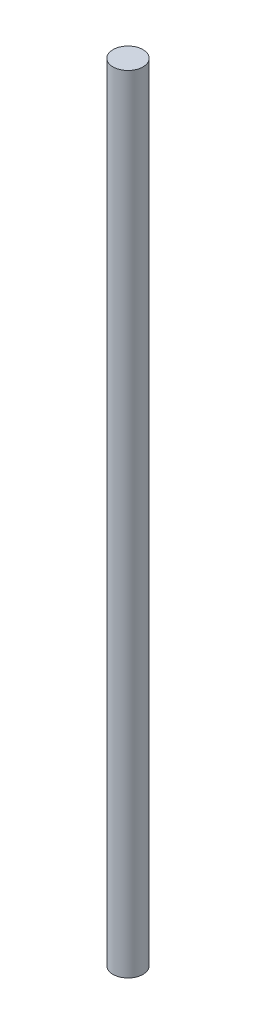
ISO-10303-21;
HEADER;
FILE_DESCRIPTION(('STEP AP214'),'2;1');
FILE_NAME('part.step','',(''),(''),'','','');
FILE_SCHEMA(('AUTOMOTIVE_DESIGN { 1 0 10303 214 1 1 1 1 }'));
ENDSEC;
DATA;
#1=APPLICATION_CONTEXT('core data for automotive mechanical design processes');
#2=APPLICATION_PROTOCOL_DEFINITION('international standard','automotive_design',2000,#1);
#3=PRODUCT_CONTEXT('',#1,'mechanical');
#4=PRODUCT('Part','Part','',(#3));
#5=PRODUCT_RELATED_PRODUCT_CATEGORY('part','',(#4));
#6=PRODUCT_DEFINITION_FORMATION('','',#4);
#7=PRODUCT_DEFINITION_CONTEXT('part definition',#1,'design');
#8=PRODUCT_DEFINITION('design','',#6,#7);
#9=PRODUCT_DEFINITION_SHAPE('','',#8);
#10=(LENGTH_UNIT() NAMED_UNIT(*) SI_UNIT(.MILLI.,.METRE.));
#11=(NAMED_UNIT(*) PLANE_ANGLE_UNIT() SI_UNIT($,.RADIAN.));
#12=(NAMED_UNIT(*) SI_UNIT($,.STERADIAN.) SOLID_ANGLE_UNIT());
#13=UNCERTAINTY_MEASURE_WITH_UNIT(LENGTH_MEASURE(1.E-05),#10,'distance_accuracy_value','');
#14=(GEOMETRIC_REPRESENTATION_CONTEXT(3) GLOBAL_UNCERTAINTY_ASSIGNED_CONTEXT((#13)) GLOBAL_UNIT_ASSIGNED_CONTEXT((#10,
#11,#12)) REPRESENTATION_CONTEXT('',''));
#15=CARTESIAN_POINT('',(0.,0.,0.));
#16=DIRECTION('',(0.,0.,1.));
#17=DIRECTION('',(1.,0.,0.));
#18=AXIS2_PLACEMENT_3D('',#15,#16,#17);
#19=CARTESIAN_POINT('',(0.,393.,0.));
#20=DIRECTION('',(0.,-1.,0.));
#21=DIRECTION('',(0.,0.,-1.));
#22=AXIS2_PLACEMENT_3D('',#19,#20,#21);
#23=CYLINDRICAL_SURFACE('',#22,7.5);
#24=CARTESIAN_POINT('',(0.,393.,0.));
#25=DIRECTION('',(0.,1.,0.));
#26=DIRECTION('',(0.,0.,1.));
#27=AXIS2_PLACEMENT_3D('',#24,#25,#26);
#28=CIRCLE('',#27,7.5);
#29=CARTESIAN_POINT('',(0.,393.,7.5));
#30=VERTEX_POINT('',#29);
#31=EDGE_CURVE('E10',#30,#30,#28,.T.);
#32=ORIENTED_EDGE('',*,*,#31,.F.);
#33=EDGE_LOOP('',(#32));
#34=FACE_BOUND('',#33,.T.);
#35=CARTESIAN_POINT('',(0.,0.,0.));
#36=DIRECTION('',(0.,1.,0.));
#37=DIRECTION('',(0.,0.,1.));
#38=AXIS2_PLACEMENT_3D('',#35,#36,#37);
#39=CIRCLE('',#38,7.5);
#40=CARTESIAN_POINT('',(0.,0.,7.5));
#41=VERTEX_POINT('',#40);
#42=EDGE_CURVE('E46',#41,#41,#39,.T.);
#43=ORIENTED_EDGE('',*,*,#42,.T.);
#44=EDGE_LOOP('',(#43));
#45=FACE_BOUND('',#44,.T.);
#46=ADVANCED_FACE('F43',(#34,#45),#23,.T.);
#47=CARTESIAN_POINT('',(0.,393.,0.));
#48=DIRECTION('',(0.,1.,0.));
#49=DIRECTION('',(0.,0.,1.));
#50=AXIS2_PLACEMENT_3D('',#47,#48,#49);
#51=PLANE('',#50);
#52=ORIENTED_EDGE('',*,*,#31,.T.);
#53=EDGE_LOOP('',(#52));
#54=FACE_BOUND('',#53,.T.);
#55=ADVANCED_FACE('F60',(#54),#51,.T.);
#56=CARTESIAN_POINT('',(0.,0.,0.));
#57=DIRECTION('',(0.,1.,0.));
#58=DIRECTION('',(0.,0.,1.));
#59=AXIS2_PLACEMENT_3D('',#56,#57,#58);
#60=PLANE('',#59);
#61=ORIENTED_EDGE('',*,*,#42,.F.);
#62=EDGE_LOOP('',(#61));
#63=FACE_BOUND('',#62,.T.);
#64=ADVANCED_FACE('F58',(#63),#60,.F.);
#65=CLOSED_SHELL('',(#46,#55,#64));
#66=MANIFOLD_SOLID_BREP('B2',#65);
#67=ADVANCED_BREP_SHAPE_REPRESENTATION('',(#18,#66),#14);
#68=SHAPE_DEFINITION_REPRESENTATION(#9,#67);
ENDSEC;
END-ISO-10303-21;
